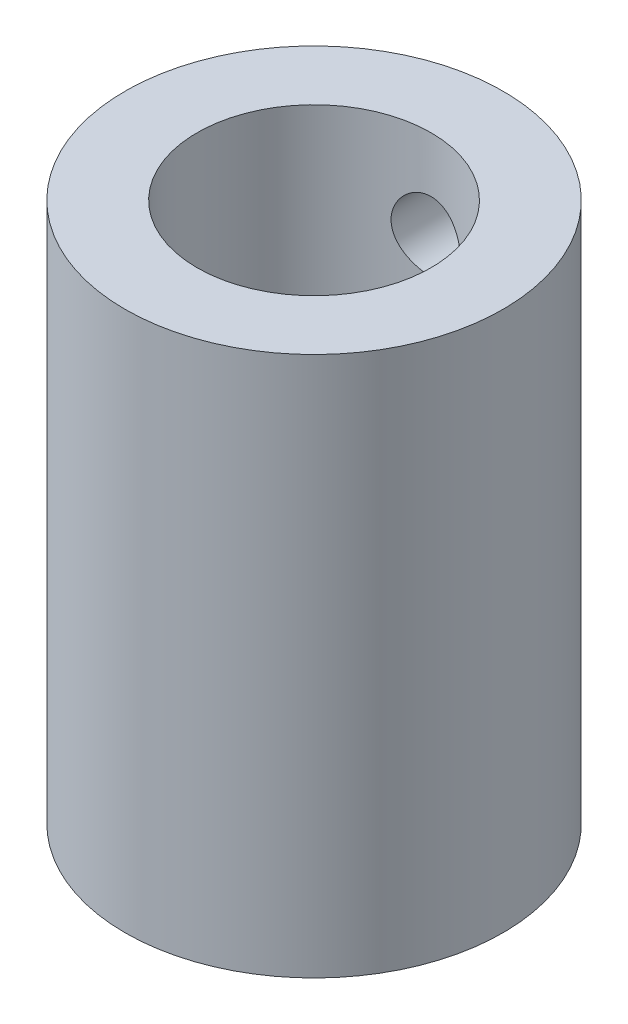
ISO-10303-21;
HEADER;
FILE_DESCRIPTION(('STEP AP214'),'2;1');
FILE_NAME('part.step','',(''),(''),'','','');
FILE_SCHEMA(('AUTOMOTIVE_DESIGN { 1 0 10303 214 1 1 1 1 }'));
ENDSEC;
DATA;
#1=APPLICATION_CONTEXT('core data for automotive mechanical design processes');
#2=APPLICATION_PROTOCOL_DEFINITION('international standard','automotive_design',2000,#1);
#3=PRODUCT_CONTEXT('',#1,'mechanical');
#4=PRODUCT('Part','Part','',(#3));
#5=PRODUCT_RELATED_PRODUCT_CATEGORY('part','',(#4));
#6=PRODUCT_DEFINITION_FORMATION('','',#4);
#7=PRODUCT_DEFINITION_CONTEXT('part definition',#1,'design');
#8=PRODUCT_DEFINITION('design','',#6,#7);
#9=PRODUCT_DEFINITION_SHAPE('','',#8);
#10=(LENGTH_UNIT() NAMED_UNIT(*) SI_UNIT(.MILLI.,.METRE.));
#11=(NAMED_UNIT(*) PLANE_ANGLE_UNIT() SI_UNIT($,.RADIAN.));
#12=(NAMED_UNIT(*) SI_UNIT($,.STERADIAN.) SOLID_ANGLE_UNIT());
#13=UNCERTAINTY_MEASURE_WITH_UNIT(LENGTH_MEASURE(1.E-05),#10,'distance_accuracy_value','');
#14=(GEOMETRIC_REPRESENTATION_CONTEXT(3) GLOBAL_UNCERTAINTY_ASSIGNED_CONTEXT((#13)) GLOBAL_UNIT_ASSIGNED_CONTEXT((#10,
#11,#12)) REPRESENTATION_CONTEXT('',''));
#15=CARTESIAN_POINT('',(0.,0.,0.));
#16=DIRECTION('',(0.,0.,1.));
#17=DIRECTION('',(1.,0.,0.));
#18=AXIS2_PLACEMENT_3D('',#15,#16,#17);
#19=CARTESIAN_POINT('',(0.,15.,0.));
#20=DIRECTION('',(0.,1.,0.));
#21=DIRECTION('',(0.,0.,1.));
#22=AXIS2_PLACEMENT_3D('',#19,#20,#21);
#23=PLANE('',#22);
#24=CARTESIAN_POINT('',(0.,15.,0.));
#25=DIRECTION('',(0.,1.,0.));
#26=DIRECTION('',(0.,0.,1.));
#27=AXIS2_PLACEMENT_3D('',#24,#25,#26);
#28=CIRCLE('',#27,5.25);
#29=CARTESIAN_POINT('',(0.,15.,5.25));
#30=VERTEX_POINT('',#29);
#31=EDGE_CURVE('E10',#30,#30,#28,.T.);
#32=ORIENTED_EDGE('',*,*,#31,.T.);
#33=EDGE_LOOP('',(#32));
#34=FACE_BOUND('',#33,.T.);
#35=CARTESIAN_POINT('',(0.,15.,0.));
#36=DIRECTION('',(0.,1.,0.));
#37=DIRECTION('',(0.,0.,1.));
#38=AXIS2_PLACEMENT_3D('',#35,#36,#37);
#39=CIRCLE('',#38,3.25);
#40=CARTESIAN_POINT('',(0.,15.,3.25));
#41=VERTEX_POINT('',#40);
#42=EDGE_CURVE('E48',#41,#41,#39,.T.);
#43=ORIENTED_EDGE('',*,*,#42,.F.);
#44=EDGE_LOOP('',(#43));
#45=FACE_BOUND('',#44,.T.);
#46=ADVANCED_FACE('F31',(#34,#45),#23,.T.);
#47=CARTESIAN_POINT('',(0.,0.,0.));
#48=DIRECTION('',(0.,1.,0.));
#49=DIRECTION('',(0.,0.,1.));
#50=AXIS2_PLACEMENT_3D('',#47,#48,#49);
#51=PLANE('',#50);
#52=CARTESIAN_POINT('',(0.,0.,0.));
#53=DIRECTION('',(0.,1.,0.));
#54=DIRECTION('',(0.,0.,1.));
#55=AXIS2_PLACEMENT_3D('',#52,#53,#54);
#56=CIRCLE('',#55,5.25);
#57=CARTESIAN_POINT('',(0.,0.,5.25));
#58=VERTEX_POINT('',#57);
#59=EDGE_CURVE('E43',#58,#58,#56,.T.);
#60=ORIENTED_EDGE('',*,*,#59,.F.);
#61=EDGE_LOOP('',(#60));
#62=FACE_BOUND('',#61,.T.);
#63=CARTESIAN_POINT('',(0.,0.,0.));
#64=DIRECTION('',(0.,1.,0.));
#65=DIRECTION('',(0.,0.,1.));
#66=AXIS2_PLACEMENT_3D('',#63,#64,#65);
#67=CIRCLE('',#66,3.25);
#68=CARTESIAN_POINT('',(0.,0.,3.25));
#69=VERTEX_POINT('',#68);
#70=EDGE_CURVE('E50',#69,#69,#67,.T.);
#71=ORIENTED_EDGE('',*,*,#70,.T.);
#72=EDGE_LOOP('',(#71));
#73=FACE_BOUND('',#72,.T.);
#74=ADVANCED_FACE('F69',(#62,#73),#51,.F.);
#75=CARTESIAN_POINT('',(0.,15.,0.));
#76=DIRECTION('',(0.,-1.,0.));
#77=DIRECTION('',(0.,0.,-1.));
#78=AXIS2_PLACEMENT_3D('',#75,#76,#77);
#79=CYLINDRICAL_SURFACE('',#78,5.25);
#80=CARTESIAN_POINT('',(0.964762097886851,12.5,-5.16059435476971));
#81=CARTESIAN_POINT('',(0.964760018318694,12.4463020743002,-5.16059538354604));
#82=CARTESIAN_POINT('',(0.960263713783096,12.3925769355066,-5.16144157414288));
#83=CARTESIAN_POINT('',(0.942408607858207,12.2866401702079,-5.16473090457296));
#84=CARTESIAN_POINT('',(0.929042165658657,12.2344298891192,-5.16717542119075));
#85=CARTESIAN_POINT('',(0.893869941696462,12.1330710401581,-5.17337540808253));
#86=CARTESIAN_POINT('',(0.872071869204707,12.0839197229117,-5.1771296805042));
#87=CARTESIAN_POINT('',(0.820675356605681,11.9899752876434,-5.18552474924606));
#88=CARTESIAN_POINT('',(0.791077575311118,11.9451818019689,-5.19016547068204));
#89=CARTESIAN_POINT('',(0.724544494550329,11.8606851705307,-5.19987253706859));
#90=CARTESIAN_POINT('',(0.687533977647412,11.8210417052171,-5.20494290948047));
#91=CARTESIAN_POINT('',(0.607388585050396,11.7484901271113,-5.21490236565346));
#92=CARTESIAN_POINT('',(0.564253315147202,11.7155824481894,-5.21979143771992));
#93=CARTESIAN_POINT('',(0.472691831634289,11.6572087348277,-5.22888047915013));
#94=CARTESIAN_POINT('',(0.42422925778494,11.6317988375841,-5.23307515180973));
#95=CARTESIAN_POINT('',(0.323633183284587,11.5895034951853,-5.24025773559504));
#96=CARTESIAN_POINT('',(0.271499972895531,11.5726173768582,-5.24324574201439));
#97=CARTESIAN_POINT('',(0.165660628006549,11.5480331069427,-5.24764988180718));
#98=CARTESIAN_POINT('',(0.111978576606563,11.5402344038757,-5.249083205104));
#99=CARTESIAN_POINT('',(0.004050133671623,11.5337331559653,-5.25027569620968));
#100=CARTESIAN_POINT('',(-0.0501962112612516,11.535029865841,-5.2500350011881));
#101=CARTESIAN_POINT('',(-0.157024204546363,11.5466052750613,-5.24792004147086));
#102=CARTESIAN_POINT('',(-0.20961802930488,11.556775716202,-5.24606546658213));
#103=CARTESIAN_POINT('',(-0.312339653972911,11.5856388082498,-5.24095318398432));
#104=CARTESIAN_POINT('',(-0.362467366587707,11.6043317605941,-5.23769542664557));
#105=CARTESIAN_POINT('',(-0.459149326110839,11.6498132285157,-5.2301097925471));
#106=CARTESIAN_POINT('',(-0.505682629930994,11.6766452690374,-5.225776185729));
#107=CARTESIAN_POINT('',(-0.593626755630485,11.7376112154441,-5.21651852741764));
#108=CARTESIAN_POINT('',(-0.635037075761311,11.7717458356566,-5.21159441818304));
#109=CARTESIAN_POINT('',(-0.712200846903309,11.8469452873156,-5.20161596046085));
#110=CARTESIAN_POINT('',(-0.747861962681658,11.8881048157076,-5.19656076200049));
#111=CARTESIAN_POINT('',(-0.811788469577786,11.9758695898496,-5.18695937960205));
#112=CARTESIAN_POINT('',(-0.840053760746127,12.0224749091833,-5.18241320254351));
#113=CARTESIAN_POINT('',(-0.888411047091904,12.119927844912,-5.17434350113034));
#114=CARTESIAN_POINT('',(-0.908490057190706,12.1707820481425,-5.17082160400509));
#115=CARTESIAN_POINT('',(-0.939793293928589,12.2752213126868,-5.16522448045272));
#116=CARTESIAN_POINT('',(-0.951018481306038,12.3288060770324,-5.16314909706558));
#117=CARTESIAN_POINT('',(-0.964161520640173,12.4363539745242,-5.16071091520697));
#118=CARTESIAN_POINT('',(-0.966211836018145,12.4903003836943,-5.16032374504362));
#119=CARTESIAN_POINT('',(-0.96130162313804,12.5977648584325,-5.16124066512287));
#120=CARTESIAN_POINT('',(-0.954341521986871,12.6512829441828,-5.16254467520107));
#121=CARTESIAN_POINT('',(-0.931721621422368,12.7559388784893,-5.16667435914494));
#122=CARTESIAN_POINT('',(-0.916130884478466,12.807092173511,-5.1694879479071));
#123=CARTESIAN_POINT('',(-0.876765394503294,12.9060603732586,-5.17630940831824));
#124=CARTESIAN_POINT('',(-0.852990059138647,12.9538750401502,-5.18031736494365));
#125=CARTESIAN_POINT('',(-0.797623942799269,13.0453933867427,-5.18913167767735));
#126=CARTESIAN_POINT('',(-0.76594925608385,13.0890454838583,-5.19394641034269));
#127=CARTESIAN_POINT('',(-0.695797084845668,13.170462855509,-5.20380804124626));
#128=CARTESIAN_POINT('',(-0.657319013860763,13.2082276220188,-5.20885495947148));
#129=CARTESIAN_POINT('',(-0.574061585877905,13.2772911097905,-5.21869039000183));
#130=CARTESIAN_POINT('',(-0.529207879703152,13.3085008825399,-5.22347476804553));
#131=CARTESIAN_POINT('',(-0.434816865371863,13.3629415822156,-5.23217711464416));
#132=CARTESIAN_POINT('',(-0.38527973255624,13.3861728076967,-5.23609511561671));
#133=CARTESIAN_POINT('',(-0.283177255032376,13.4238628157595,-5.2426054406432));
#134=CARTESIAN_POINT('',(-0.230628676237088,13.4383658146381,-5.24520443595573));
#135=CARTESIAN_POINT('',(-0.123789446869942,13.4583290517605,-5.24881232573633));
#136=CARTESIAN_POINT('',(-0.0694989726142072,13.4637902023027,-5.24982138062465));
#137=CARTESIAN_POINT('',(0.0384289118555798,13.4654839880311,-5.25013267960833));
#138=CARTESIAN_POINT('',(0.0920641856880344,13.4618511483792,-5.24945980429946));
#139=CARTESIAN_POINT('',(0.19794639421196,13.4457540218863,-5.24653437746579));
#140=CARTESIAN_POINT('',(0.250193341094456,13.433289812621,-5.24428183981691));
#141=CARTESIAN_POINT('',(0.35174837130671,13.3999395247066,-5.23844996892734));
#142=CARTESIAN_POINT('',(0.401061113870065,13.3790672303613,-5.23487280805947));
#143=CARTESIAN_POINT('',(0.495504757514849,13.32950915377,-5.22677952986265));
#144=CARTESIAN_POINT('',(0.540635393095003,13.3008228759077,-5.22226335297917));
#145=CARTESIAN_POINT('',(0.626105502848321,13.2359854540726,-5.21271226284843));
#146=CARTESIAN_POINT('',(0.666370358722481,13.1997368623398,-5.20767105726491));
#147=CARTESIAN_POINT('',(0.740292578318379,13.1210064903649,-5.19767849877264));
#148=CARTESIAN_POINT('',(0.773948387875828,13.0785232480944,-5.19272716724626));
#149=CARTESIAN_POINT('',(0.833975363477081,12.988081209737,-5.18342729047864));
#150=CARTESIAN_POINT('',(0.860279579160631,12.9400773751714,-5.17908445413998));
#151=CARTESIAN_POINT('',(0.904408506888212,12.8402684388881,-5.17156170796702));
#152=CARTESIAN_POINT('',(0.922241311363547,12.7884670197036,-5.16838068896519));
#153=CARTESIAN_POINT('',(0.945249886355253,12.6970858795999,-5.16421302422931));
#154=CARTESIAN_POINT('',(0.952554578657319,12.6580448337022,-5.16286398374671));
#155=CARTESIAN_POINT('',(0.962311391242214,12.5793408006598,-5.16105428018776));
#156=CARTESIAN_POINT('',(0.964763634496492,12.5396778293018,-5.1605935945986));
#157=CARTESIAN_POINT('',(0.964762097886851,12.5,-5.16059435476971));
#158=B_SPLINE_CURVE_WITH_KNOTS('',3,(#80,#81,#82,#83,#84,#85,#86,#87,#88,#89,#90,#91,#92,#93,
#94,#95,#96,#97,#98,#99,#100,#101,#102,#103,#104,#105,#106,#107,#108,#109,#110,#111,#112,#113,
#114,#115,#116,#117,#118,#119,#120,#121,#122,#123,#124,#125,#126,#127,#128,#129,#130,#131,#132,
#133,#134,#135,#136,#137,#138,#139,#140,#141,#142,#143,#144,#145,#146,#147,#148,#149,#150,#151,
#152,#153,#154,#155,#156,#157),.UNSPECIFIED.,.T.,.F.,(4,2,2,2,2,2,2,2,2,2,2,2,2,2,2,2,2,2,2,2,2,
2,2,2,2,2,2,2,2,2,2,2,2,2,2,2,2,2,4),(0.,0.160948596307413,0.322036015351489,0.482976494581889,
0.643903384116909,0.806554463318676,0.969216016024276,1.13306622056598,1.29690348288909,
1.4589101483295,1.62090353905151,1.78094783997857,1.94099780203685,2.10191921203922,
2.26285637033757,2.42616470945811,2.58947525546353,2.75304384615483,2.91659468538965,
3.07777645643287,3.23895058750438,3.39885326381282,3.55876731953328,3.72045825696688,
3.88216313920816,4.04593775156523,4.20970623485712,4.37263794313716,4.53555321104136,
4.69607279651771,4.85659097199076,5.01684705631968,5.17711330755423,5.33958872642111,
5.50210230690572,5.66605094112305,5.82984264465726,5.94877187126732,6.06769808391752),.UNSPECIFIED.);
#159=CARTESIAN_POINT('',(0.964762097886851,12.5,-5.16059435476971));
#160=VERTEX_POINT('',#159);
#161=EDGE_CURVE('E55',#160,#160,#158,.T.);
#162=ORIENTED_EDGE('',*,*,#161,.F.);
#163=EDGE_LOOP('',(#162));
#164=FACE_BOUND('',#163,.T.);
#165=ORIENTED_EDGE('',*,*,#31,.F.);
#166=EDGE_LOOP('',(#165));
#167=FACE_BOUND('',#166,.T.);
#168=ORIENTED_EDGE('',*,*,#59,.T.);
#169=EDGE_LOOP('',(#168));
#170=FACE_BOUND('',#169,.T.);
#171=ADVANCED_FACE('F33',(#164,#167,#170),#79,.T.);
#172=CARTESIAN_POINT('',(0.,15.,0.));
#173=DIRECTION('',(0.,-1.,0.));
#174=DIRECTION('',(0.,0.,-1.));
#175=AXIS2_PLACEMENT_3D('',#172,#173,#174);
#176=CYLINDRICAL_SURFACE('',#175,3.25);
#177=CARTESIAN_POINT('',(0.,13.4647620978868,-3.25));
#178=CARTESIAN_POINT('',(-0.0529515614386266,13.4647613875367,-3.24999950246102));
#179=CARTESIAN_POINT('',(-0.105910318854559,13.4603882079547,-3.24869349949808));
#180=CARTESIAN_POINT('',(-0.210287254584051,13.4430514989298,-3.24361110649489));
#181=CARTESIAN_POINT('',(-0.26170494048786,13.4300852537444,-3.23983393547442));
#182=CARTESIAN_POINT('',(-0.361479067388746,13.3960322996427,-3.23022338201921));
#183=CARTESIAN_POINT('',(-0.409839850483712,13.3749574245943,-3.22439299712429));
#184=CARTESIAN_POINT('',(-0.502341225554887,13.3253335231359,-3.21128301130494));
#185=CARTESIAN_POINT('',(-0.546481281486133,13.2967835490827,-3.20400322666332));
#186=CARTESIAN_POINT('',(-0.630531672245153,13.2321722670869,-3.18854256916156));
#187=CARTESIAN_POINT('',(-0.670306304328292,13.1959387868982,-3.1803435225011));
#188=CARTESIAN_POINT('',(-0.743313234644649,13.1173560852934,-3.16407763314388));
#189=CARTESIAN_POINT('',(-0.776544459663639,13.0750058626135,-3.15601081233268));
#190=CARTESIAN_POINT('',(-0.836230101578416,12.9842500930496,-3.14073110633186));
#191=CARTESIAN_POINT('',(-0.862519832231667,12.9357320747577,-3.13354084055674));
#192=CARTESIAN_POINT('',(-0.906512008361525,12.8347158273718,-3.12109954479526));
#193=CARTESIAN_POINT('',(-0.92421646734083,12.7822185348795,-3.11584806017581));
#194=CARTESIAN_POINT('',(-0.950047978705162,12.6762558132066,-3.10806813675217));
#195=CARTESIAN_POINT('',(-0.958424814653732,12.6228566165298,-3.1054688439407));
#196=CARTESIAN_POINT('',(-0.966143161245226,12.5153523879147,-3.10307672873645));
#197=CARTESIAN_POINT('',(-0.965486809703079,12.4612475260088,-3.10328324231493));
#198=CARTESIAN_POINT('',(-0.955353814006142,12.3558907120715,-3.10641655012457));
#199=CARTESIAN_POINT('',(-0.946189010964558,12.3046054356023,-3.10924716385358));
#200=CARTESIAN_POINT('',(-0.919802665476615,12.204335824858,-3.11715429038424));
#201=CARTESIAN_POINT('',(-0.902580342901574,12.155351713887,-3.12223102065222));
#202=CARTESIAN_POINT('',(-0.860335773585481,12.0603072316816,-3.13413587881495));
#203=CARTESIAN_POINT('',(-0.835211589130073,12.0142951295366,-3.14098667637429));
#204=CARTESIAN_POINT('',(-0.777947350916781,11.9270350178342,-3.15565673369982));
#205=CARTESIAN_POINT('',(-0.745805627542408,11.8857881455998,-3.16347622374597));
#206=CARTESIAN_POINT('',(-0.673865407797435,11.8074592962391,-3.17959370265272));
#207=CARTESIAN_POINT('',(-0.633807807420135,11.7706162254272,-3.18789819089109));
#208=CARTESIAN_POINT('',(-0.547979337479717,11.7041156780625,-3.20376662698321));
#209=CARTESIAN_POINT('',(-0.502208123384437,11.6744586351462,-3.21133053013038));
#210=CARTESIAN_POINT('',(-0.405823906904748,11.623030993941,-3.22493219664309));
#211=CARTESIAN_POINT('',(-0.35518161773677,11.601312422048,-3.2309598164526));
#212=CARTESIAN_POINT('',(-0.250742899057025,11.5667707940624,-3.24073667542982));
#213=CARTESIAN_POINT('',(-0.196947334569054,11.5539453106404,-3.24448653626718));
#214=CARTESIAN_POINT('',(-0.0897608919371329,11.5379494125299,-3.24918746549632));
#215=CARTESIAN_POINT('',(-0.0364223915576863,11.5344551138643,-3.25023238107118));
#216=CARTESIAN_POINT('',(0.0700818677491929,11.5363142980668,-3.24968046757112));
#217=CARTESIAN_POINT('',(0.123247648302049,11.5416666268584,-3.24808398307693));
#218=CARTESIAN_POINT('',(0.226681424460483,11.5608048267691,-3.24249001640934));
#219=CARTESIAN_POINT('',(0.276987456670737,11.5744022958197,-3.23854620688013));
#220=CARTESIAN_POINT('',(0.374593844409629,11.6094189050561,-3.22871301236912));
#221=CARTESIAN_POINT('',(0.421893840666485,11.6308389781183,-3.22282339535011));
#222=CARTESIAN_POINT('',(0.513343854430994,11.6814420052958,-3.20954254793037));
#223=CARTESIAN_POINT('',(0.557397399379607,11.7107909007004,-3.20212012739263));
#224=CARTESIAN_POINT('',(0.640064913342517,11.7762161606736,-3.18662654244232));
#225=CARTESIAN_POINT('',(0.678677542770846,11.8122941769292,-3.17855521903153));
#226=CARTESIAN_POINT('',(0.750787418462631,11.8916745765827,-3.16231473242953));
#227=CARTESIAN_POINT('',(0.784054373527339,11.9351879775922,-3.15415226983962));
#228=CARTESIAN_POINT('',(0.84282922481663,12.0273567802169,-3.13895902410519));
#229=CARTESIAN_POINT('',(0.868337341340005,12.0760120357851,-3.13192820883217));
#230=CARTESIAN_POINT('',(0.910692892238027,12.176916928991,-3.1198756435646));
#231=CARTESIAN_POINT('',(0.927582086456876,12.2291478174268,-3.11484423296539));
#232=CARTESIAN_POINT('',(0.952277081895867,12.3358888154674,-3.10738442904207));
#233=CARTESIAN_POINT('',(0.960085913576487,12.3903981583705,-3.1049551673038));
#234=CARTESIAN_POINT('',(0.9661954649541,12.4977599662143,-3.10305901930957));
#235=CARTESIAN_POINT('',(0.96487103227957,12.5505893199081,-3.10347533829357));
#236=CARTESIAN_POINT('',(0.953643915871304,12.6552358870582,-3.10694335999191));
#237=CARTESIAN_POINT('',(0.943741562369138,12.7070531393997,-3.10999496125352));
#238=CARTESIAN_POINT('',(0.915879384317571,12.8076058907908,-3.11831219508331));
#239=CARTESIAN_POINT('',(0.898016845323894,12.8563707247248,-3.1235510487132));
#240=CARTESIAN_POINT('',(0.854816941241445,12.9502502142655,-3.13564807880256));
#241=CARTESIAN_POINT('',(0.829478168805007,12.9953641805831,-3.14250656009683));
#242=CARTESIAN_POINT('',(0.770983914575744,13.0824057990211,-3.15737614206326));
#243=CARTESIAN_POINT('',(0.737581356263624,13.1241618673173,-3.16541968482068));
#244=CARTESIAN_POINT('',(0.664354903995127,13.2015976676989,-3.18159337023087));
#245=CARTESIAN_POINT('',(0.624529355991387,13.2372758297233,-3.18972353468541));
#246=CARTESIAN_POINT('',(0.538224085963048,13.3025521844621,-3.20543133305079));
#247=CARTESIAN_POINT('',(0.491587436787632,13.3319487996839,-3.21298670138837));
#248=CARTESIAN_POINT('',(0.393809367963485,13.3824420901194,-3.22642883931216));
#249=CARTESIAN_POINT('',(0.342670150868514,13.4035427961961,-3.23231641886333));
#250=CARTESIAN_POINT('',(0.243293205366536,13.4348665511832,-3.24122062479223));
#251=CARTESIAN_POINT('',(0.195377939356852,13.4460474534491,-3.24448601451661));
#252=CARTESIAN_POINT('',(0.098310384077796,13.4609949663793,-3.24887576265042));
#253=CARTESIAN_POINT('',(0.0491582929965447,13.4647627573499,-3.25000046189699));
#254=CARTESIAN_POINT('',(0.,13.4647620978868,-3.25));
#255=B_SPLINE_CURVE_WITH_KNOTS('',3,(#177,#178,#179,#180,#181,#182,#183,#184,#185,#186,#187,
#188,#189,#190,#191,#192,#193,#194,#195,#196,#197,#198,#199,#200,#201,#202,#203,#204,#205,#206,
#207,#208,#209,#210,#211,#212,#213,#214,#215,#216,#217,#218,#219,#220,#221,#222,#223,#224,#225,
#226,#227,#228,#229,#230,#231,#232,#233,#234,#235,#236,#237,#238,#239,#240,#241,#242,#243,#244,
#245,#246,#247,#248,#249,#250,#251,#252,#253,#254),.UNSPECIFIED.,.T.,.F.,(4,2,2,2,2,2,2,2,2,2,2,
2,2,2,2,2,2,2,2,2,2,2,2,2,2,2,2,2,2,2,2,2,2,2,2,2,2,2,4),(0.,0.1586741442865,0.317398459693607,
0.475892003533475,0.634405649865956,0.796940408878273,0.959501803797907,1.12562992936766,
1.29171907406233,1.45324474613311,1.6147321918243,1.77052519723252,1.92633328963511,
2.08424006542207,2.24218445149054,2.40657962399874,2.5709847143649,2.73644872677523,
2.90186755871306,3.06146521940755,3.22104206161893,3.37710317687986,3.53318290912382,
3.69282315940104,3.85250264564436,4.01785143508599,4.18319552929659,4.34773071618826,
4.51221097568971,4.66998200636475,4.82774696346311,4.98363452940496,5.13955145881251,
5.30104277402557,5.46257574305825,5.62869883439183,5.79474110885473,5.9420718407984,
6.0893791130278),.UNSPECIFIED.);
#256=CARTESIAN_POINT('',(0.,13.4647620978868,-3.25));
#257=VERTEX_POINT('',#256);
#258=EDGE_CURVE('E35',#257,#257,#255,.T.);
#259=ORIENTED_EDGE('',*,*,#258,.F.);
#260=EDGE_LOOP('',(#259));
#261=FACE_BOUND('',#260,.T.);
#262=ORIENTED_EDGE('',*,*,#42,.T.);
#263=EDGE_LOOP('',(#262));
#264=FACE_BOUND('',#263,.T.);
#265=ORIENTED_EDGE('',*,*,#70,.F.);
#266=EDGE_LOOP('',(#265));
#267=FACE_BOUND('',#266,.T.);
#268=ADVANCED_FACE('F63',(#261,#264,#267),#176,.F.);
#269=CARTESIAN_POINT('',(0.,12.5,-5.251));
#270=DIRECTION('',(0.,0.,1.));
#271=DIRECTION('',(1.,0.,0.));
#272=AXIS2_PLACEMENT_3D('',#269,#270,#271);
#273=CYLINDRICAL_SURFACE('',#272,0.96476209788685);
#274=ORIENTED_EDGE('',*,*,#258,.T.);
#275=EDGE_LOOP('',(#274));
#276=FACE_BOUND('',#275,.T.);
#277=ORIENTED_EDGE('',*,*,#161,.T.);
#278=EDGE_LOOP('',(#277));
#279=FACE_BOUND('',#278,.T.);
#280=ADVANCED_FACE('F60',(#276,#279),#273,.F.);
#281=CLOSED_SHELL('',(#46,#74,#171,#268,#280));
#282=MANIFOLD_SOLID_BREP('B2',#281);
#283=ADVANCED_BREP_SHAPE_REPRESENTATION('',(#18,#282),#14);
#284=SHAPE_DEFINITION_REPRESENTATION(#9,#283);
ENDSEC;
END-ISO-10303-21;
